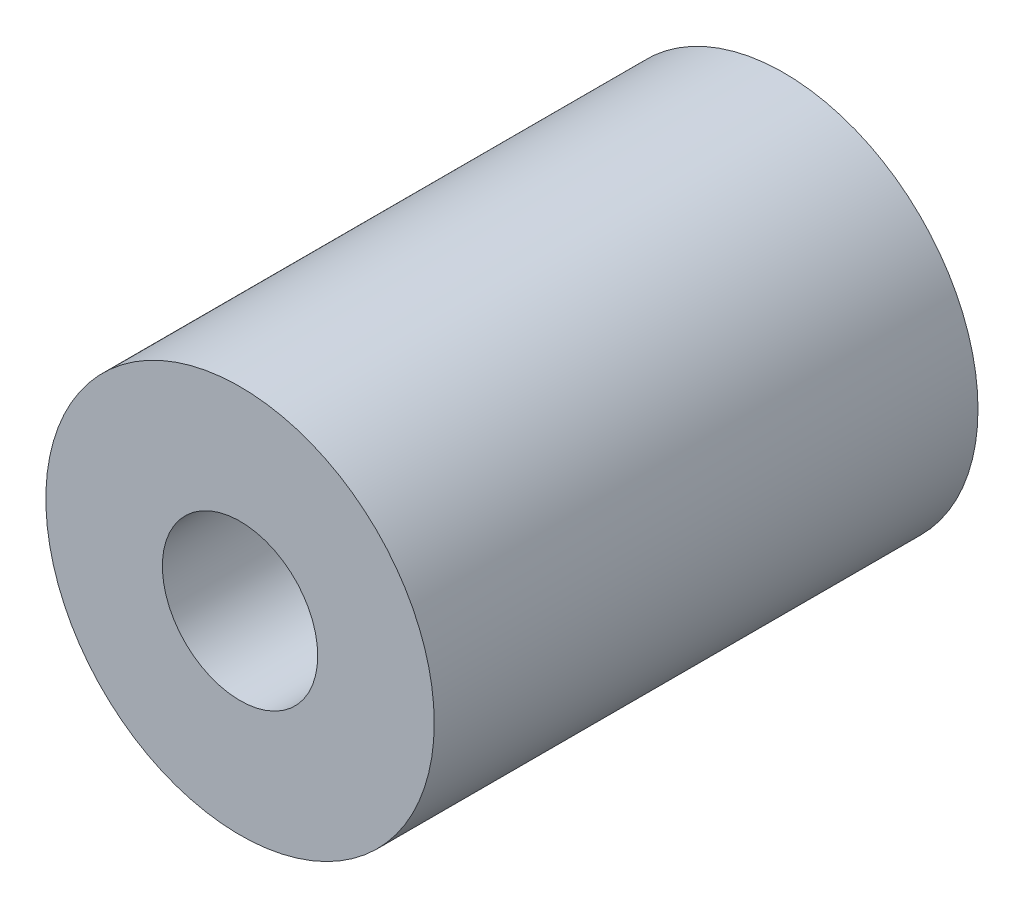
ISO-10303-21;
HEADER;
FILE_DESCRIPTION(('STEP AP214'),'2;1');
FILE_NAME('part.step','',(''),(''),'','','');
FILE_SCHEMA(('AUTOMOTIVE_DESIGN { 1 0 10303 214 1 1 1 1 }'));
ENDSEC;
DATA;
#1=APPLICATION_CONTEXT('core data for automotive mechanical design processes');
#2=APPLICATION_PROTOCOL_DEFINITION('international standard','automotive_design',2000,#1);
#3=PRODUCT_CONTEXT('',#1,'mechanical');
#4=PRODUCT('Part','Part','',(#3));
#5=PRODUCT_RELATED_PRODUCT_CATEGORY('part','',(#4));
#6=PRODUCT_DEFINITION_FORMATION('','',#4);
#7=PRODUCT_DEFINITION_CONTEXT('part definition',#1,'design');
#8=PRODUCT_DEFINITION('design','',#6,#7);
#9=PRODUCT_DEFINITION_SHAPE('','',#8);
#10=(LENGTH_UNIT() NAMED_UNIT(*) SI_UNIT(.MILLI.,.METRE.));
#11=(NAMED_UNIT(*) PLANE_ANGLE_UNIT() SI_UNIT($,.RADIAN.));
#12=(NAMED_UNIT(*) SI_UNIT($,.STERADIAN.) SOLID_ANGLE_UNIT());
#13=UNCERTAINTY_MEASURE_WITH_UNIT(LENGTH_MEASURE(1.E-05),#10,'distance_accuracy_value','');
#14=(GEOMETRIC_REPRESENTATION_CONTEXT(3) GLOBAL_UNCERTAINTY_ASSIGNED_CONTEXT((#13)) GLOBAL_UNIT_ASSIGNED_CONTEXT((#10,
#11,#12)) REPRESENTATION_CONTEXT('',''));
#15=CARTESIAN_POINT('',(0.,0.,0.));
#16=DIRECTION('',(0.,0.,1.));
#17=DIRECTION('',(1.,0.,0.));
#18=AXIS2_PLACEMENT_3D('',#15,#16,#17);
#19=CARTESIAN_POINT('',(0.,0.,7.));
#20=DIRECTION('',(0.,0.,1.));
#21=DIRECTION('',(1.,0.,0.));
#22=AXIS2_PLACEMENT_3D('',#19,#20,#21);
#23=PLANE('',#22);
#24=CARTESIAN_POINT('',(0.,0.,7.));
#25=DIRECTION('',(0.,0.,1.));
#26=DIRECTION('',(1.,0.,0.));
#27=AXIS2_PLACEMENT_3D('',#24,#25,#26);
#28=CIRCLE('',#27,5.);
#29=CARTESIAN_POINT('',(5.,0.,7.));
#30=VERTEX_POINT('',#29);
#31=EDGE_CURVE('E10',#30,#30,#28,.T.);
#32=ORIENTED_EDGE('',*,*,#31,.T.);
#33=EDGE_LOOP('',(#32));
#34=FACE_BOUND('',#33,.T.);
#35=CARTESIAN_POINT('',(0.,0.,7.));
#36=DIRECTION('',(0.,0.,1.));
#37=DIRECTION('',(1.,0.,0.));
#38=AXIS2_PLACEMENT_3D('',#35,#36,#37);
#39=CIRCLE('',#38,2.);
#40=CARTESIAN_POINT('',(2.,0.,7.));
#41=VERTEX_POINT('',#40);
#42=EDGE_CURVE('E44',#41,#41,#39,.T.);
#43=ORIENTED_EDGE('',*,*,#42,.F.);
#44=EDGE_LOOP('',(#43));
#45=FACE_BOUND('',#44,.T.);
#46=ADVANCED_FACE('F33',(#34,#45),#23,.T.);
#47=CARTESIAN_POINT('',(0.,0.,-7.));
#48=DIRECTION('',(0.,0.,1.));
#49=DIRECTION('',(1.,0.,0.));
#50=AXIS2_PLACEMENT_3D('',#47,#48,#49);
#51=PLANE('',#50);
#52=CARTESIAN_POINT('',(0.,0.,-7.));
#53=DIRECTION('',(0.,0.,1.));
#54=DIRECTION('',(1.,0.,0.));
#55=AXIS2_PLACEMENT_3D('',#52,#53,#54);
#56=CIRCLE('',#55,5.);
#57=CARTESIAN_POINT('',(5.,0.,-7.));
#58=VERTEX_POINT('',#57);
#59=EDGE_CURVE('E37',#58,#58,#56,.T.);
#60=ORIENTED_EDGE('',*,*,#59,.F.);
#61=EDGE_LOOP('',(#60));
#62=FACE_BOUND('',#61,.T.);
#63=CARTESIAN_POINT('',(0.,0.,-7.));
#64=DIRECTION('',(0.,0.,1.));
#65=DIRECTION('',(1.,0.,0.));
#66=AXIS2_PLACEMENT_3D('',#63,#64,#65);
#67=CIRCLE('',#66,2.);
#68=CARTESIAN_POINT('',(2.,0.,-7.));
#69=VERTEX_POINT('',#68);
#70=EDGE_CURVE('E46',#69,#69,#67,.T.);
#71=ORIENTED_EDGE('',*,*,#70,.T.);
#72=EDGE_LOOP('',(#71));
#73=FACE_BOUND('',#72,.T.);
#74=ADVANCED_FACE('F56',(#62,#73),#51,.F.);
#75=CARTESIAN_POINT('',(0.,0.,7.));
#76=DIRECTION('',(0.,0.,-1.));
#77=DIRECTION('',(-1.,0.,0.));
#78=AXIS2_PLACEMENT_3D('',#75,#76,#77);
#79=CYLINDRICAL_SURFACE('',#78,5.);
#80=ORIENTED_EDGE('',*,*,#31,.F.);
#81=EDGE_LOOP('',(#80));
#82=FACE_BOUND('',#81,.T.);
#83=ORIENTED_EDGE('',*,*,#59,.T.);
#84=EDGE_LOOP('',(#83));
#85=FACE_BOUND('',#84,.T.);
#86=ADVANCED_FACE('F35',(#82,#85),#79,.T.);
#87=CARTESIAN_POINT('',(0.,0.,7.));
#88=DIRECTION('',(0.,0.,-1.));
#89=DIRECTION('',(-1.,0.,0.));
#90=AXIS2_PLACEMENT_3D('',#87,#88,#89);
#91=CYLINDRICAL_SURFACE('',#90,2.);
#92=ORIENTED_EDGE('',*,*,#42,.T.);
#93=EDGE_LOOP('',(#92));
#94=FACE_BOUND('',#93,.T.);
#95=ORIENTED_EDGE('',*,*,#70,.F.);
#96=EDGE_LOOP('',(#95));
#97=FACE_BOUND('',#96,.T.);
#98=ADVANCED_FACE('F52',(#94,#97),#91,.F.);
#99=CLOSED_SHELL('',(#46,#74,#86,#98));
#100=MANIFOLD_SOLID_BREP('B2',#99);
#101=ADVANCED_BREP_SHAPE_REPRESENTATION('',(#18,#100),#14);
#102=SHAPE_DEFINITION_REPRESENTATION(#9,#101);
ENDSEC;
END-ISO-10303-21;
